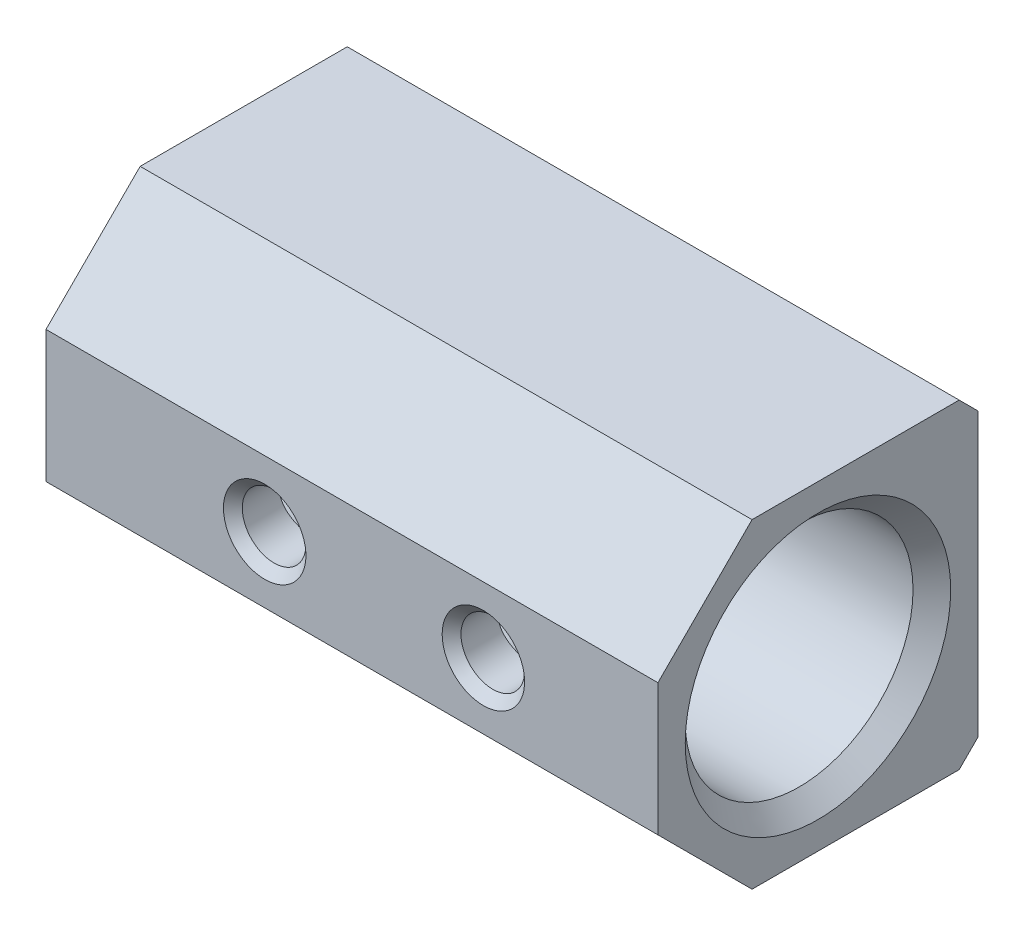
ISO-10303-21;
HEADER;
FILE_DESCRIPTION(('STEP AP214'),'2;1');
FILE_NAME('part.step','',(''),(''),'','','');
FILE_SCHEMA(('AUTOMOTIVE_DESIGN { 1 0 10303 214 1 1 1 1 }'));
ENDSEC;
DATA;
#1=APPLICATION_CONTEXT('core data for automotive mechanical design processes');
#2=APPLICATION_PROTOCOL_DEFINITION('international standard','automotive_design',2000,#1);
#3=PRODUCT_CONTEXT('',#1,'mechanical');
#4=PRODUCT('Part','Part','',(#3));
#5=PRODUCT_RELATED_PRODUCT_CATEGORY('part','',(#4));
#6=PRODUCT_DEFINITION_FORMATION('','',#4);
#7=PRODUCT_DEFINITION_CONTEXT('part definition',#1,'design');
#8=PRODUCT_DEFINITION('design','',#6,#7);
#9=PRODUCT_DEFINITION_SHAPE('','',#8);
#10=(LENGTH_UNIT() NAMED_UNIT(*) SI_UNIT(.MILLI.,.METRE.));
#11=(NAMED_UNIT(*) PLANE_ANGLE_UNIT() SI_UNIT($,.RADIAN.));
#12=(NAMED_UNIT(*) SI_UNIT($,.STERADIAN.) SOLID_ANGLE_UNIT());
#13=UNCERTAINTY_MEASURE_WITH_UNIT(LENGTH_MEASURE(1.E-05),#10,'distance_accuracy_value','');
#14=(GEOMETRIC_REPRESENTATION_CONTEXT(3) GLOBAL_UNCERTAINTY_ASSIGNED_CONTEXT((#13)) GLOBAL_UNIT_ASSIGNED_CONTEXT((#10,
#11,#12)) REPRESENTATION_CONTEXT('',''));
#15=CARTESIAN_POINT('',(0.,0.,0.));
#16=DIRECTION('',(0.,0.,1.));
#17=DIRECTION('',(1.,0.,0.));
#18=AXIS2_PLACEMENT_3D('',#15,#16,#17);
#19=CARTESIAN_POINT('',(32.5,-17.,34.));
#20=DIRECTION('',(-1.,0.,0.));
#21=DIRECTION('',(0.,0.,1.));
#22=AXIS2_PLACEMENT_3D('',#19,#20,#21);
#23=PLANE('',#22);
#24=CARTESIAN_POINT('',(32.5,0.,17.));
#25=DIRECTION('',(-1.,0.,0.));
#26=DIRECTION('',(0.,0.,1.));
#27=AXIS2_PLACEMENT_3D('',#24,#25,#26);
#28=CIRCLE('',#27,14.1);
#29=CARTESIAN_POINT('',(32.5,0.,31.1));
#30=VERTEX_POINT('',#29);
#31=EDGE_CURVE('E183',#30,#30,#28,.T.);
#32=ORIENTED_EDGE('',*,*,#31,.T.);
#33=EDGE_LOOP('',(#32));
#34=FACE_BOUND('',#33,.T.);
#35=DIRECTION('',(0.,1.,0.));
#36=VECTOR('',#35,1.);
#37=CARTESIAN_POINT('',(32.5,-17.,0.));
#38=LINE('',#37,#36);
#39=CARTESIAN_POINT('',(32.5,-15.,0.));
#40=VERTEX_POINT('',#39);
#41=CARTESIAN_POINT('',(32.5,15.,0.));
#42=VERTEX_POINT('',#41);
#43=EDGE_CURVE('E142',#40,#42,#38,.T.);
#44=ORIENTED_EDGE('',*,*,#43,.T.);
#45=DIRECTION('',(0.,0.707106781186549,0.707106781186546));
#46=VECTOR('',#45,1.);
#47=CARTESIAN_POINT('',(32.5,17.,2.00000000000001));
#48=LINE('',#47,#46);
#49=CARTESIAN_POINT('',(32.5,17.,2.00000000000001));
#50=VERTEX_POINT('',#49);
#51=EDGE_CURVE('E176',#42,#50,#48,.T.);
#52=ORIENTED_EDGE('',*,*,#51,.T.);
#53=DIRECTION('',(0.,0.,-1.));
#54=VECTOR('',#53,1.);
#55=CARTESIAN_POINT('',(32.5,17.,34.));
#56=LINE('',#55,#54);
#57=CARTESIAN_POINT('',(32.5,17.,24.));
#58=VERTEX_POINT('',#57);
#59=EDGE_CURVE('E133',#58,#50,#56,.T.);
#60=ORIENTED_EDGE('',*,*,#59,.F.);
#61=DIRECTION('',(0.,0.707106781186546,-0.707106781186549));
#62=VECTOR('',#61,1.);
#63=CARTESIAN_POINT('',(32.5,7.00000000000001,34.));
#64=LINE('',#63,#62);
#65=CARTESIAN_POINT('',(32.5,7.00000000000001,34.));
#66=VERTEX_POINT('',#65);
#67=EDGE_CURVE('E120',#58,#66,#64,.F.);
#68=ORIENTED_EDGE('',*,*,#67,.T.);
#69=DIRECTION('',(0.,1.,0.));
#70=VECTOR('',#69,1.);
#71=CARTESIAN_POINT('',(32.5,-17.,34.));
#72=LINE('',#71,#70);
#73=CARTESIAN_POINT('',(32.5,-7.00000000000001,34.));
#74=VERTEX_POINT('',#73);
#75=EDGE_CURVE('E128',#74,#66,#72,.T.);
#76=ORIENTED_EDGE('',*,*,#75,.F.);
#77=DIRECTION('',(0.,0.707106781186546,0.707106781186549));
#78=VECTOR('',#77,1.);
#79=CARTESIAN_POINT('',(32.5,-7.00000000000001,34.));
#80=LINE('',#79,#78);
#81=CARTESIAN_POINT('',(32.5,-17.,24.));
#82=VERTEX_POINT('',#81);
#83=EDGE_CURVE('E110',#74,#82,#80,.F.);
#84=ORIENTED_EDGE('',*,*,#83,.T.);
#85=DIRECTION('',(0.,0.,-1.));
#86=VECTOR('',#85,1.);
#87=CARTESIAN_POINT('',(32.5,-17.,34.));
#88=LINE('',#87,#86);
#89=CARTESIAN_POINT('',(32.5,-17.,2.00000000000001));
#90=VERTEX_POINT('',#89);
#91=EDGE_CURVE('E139',#82,#90,#88,.T.);
#92=ORIENTED_EDGE('',*,*,#91,.T.);
#93=DIRECTION('',(0.,0.707106781186549,-0.707106781186546));
#94=VECTOR('',#93,1.);
#95=CARTESIAN_POINT('',(32.5,-17.,2.00000000000001));
#96=LINE('',#95,#94);
#97=EDGE_CURVE('E57',#90,#40,#96,.T.);
#98=ORIENTED_EDGE('',*,*,#97,.T.);
#99=EDGE_LOOP('',(#44,#52,#60,#68,#76,#84,#92,#98));
#100=FACE_BOUND('',#99,.T.);
#101=ADVANCED_FACE('F41',(#34,#100),#23,.F.);
#102=CARTESIAN_POINT('',(-32.5,17.,34.));
#103=DIRECTION('',(0.,-1.,0.));
#104=DIRECTION('',(0.,0.,-1.));
#105=AXIS2_PLACEMENT_3D('',#102,#103,#104);
#106=PLANE('',#105);
#107=ORIENTED_EDGE('',*,*,#59,.T.);
#108=DIRECTION('',(-1.,0.,0.));
#109=VECTOR('',#108,1.);
#110=CARTESIAN_POINT('',(-32.5,17.,2.00000000000001));
#111=LINE('',#110,#109);
#112=CARTESIAN_POINT('',(-32.5,17.,2.00000000000001));
#113=VERTEX_POINT('',#112);
#114=EDGE_CURVE('E165',#50,#113,#111,.T.);
#115=ORIENTED_EDGE('',*,*,#114,.T.);
#116=DIRECTION('',(0.,0.,-1.));
#117=VECTOR('',#116,1.);
#118=CARTESIAN_POINT('',(-32.5,17.,34.));
#119=LINE('',#118,#117);
#120=CARTESIAN_POINT('',(-32.5,17.,24.));
#121=VERTEX_POINT('',#120);
#122=EDGE_CURVE('E152',#121,#113,#119,.T.);
#123=ORIENTED_EDGE('',*,*,#122,.F.);
#124=DIRECTION('',(1.,0.,0.));
#125=VECTOR('',#124,1.);
#126=CARTESIAN_POINT('',(-32.5,17.,24.));
#127=LINE('',#126,#125);
#128=EDGE_CURVE('E121',#121,#58,#127,.T.);
#129=ORIENTED_EDGE('',*,*,#128,.T.);
#130=EDGE_LOOP('',(#107,#115,#123,#129));
#131=FACE_BOUND('',#130,.T.);
#132=ADVANCED_FACE('F267',(#131),#106,.F.);
#133=CARTESIAN_POINT('',(-32.5,-17.,34.));
#134=DIRECTION('',(1.,0.,0.));
#135=DIRECTION('',(0.,0.,-1.));
#136=AXIS2_PLACEMENT_3D('',#133,#134,#135);
#137=PLANE('',#136);
#138=CARTESIAN_POINT('',(-32.5,0.,17.));
#139=DIRECTION('',(1.,0.,0.));
#140=DIRECTION('',(0.,0.,-1.));
#141=AXIS2_PLACEMENT_3D('',#138,#139,#140);
#142=CIRCLE('',#141,12.1);
#143=CARTESIAN_POINT('',(-32.5,0.,4.9));
#144=VERTEX_POINT('',#143);
#145=EDGE_CURVE('E145',#144,#144,#142,.T.);
#146=ORIENTED_EDGE('',*,*,#145,.T.);
#147=EDGE_LOOP('',(#146));
#148=FACE_BOUND('',#147,.T.);
#149=ORIENTED_EDGE('',*,*,#122,.T.);
#150=DIRECTION('',(0.,-0.707106781186549,-0.707106781186546));
#151=VECTOR('',#150,1.);
#152=CARTESIAN_POINT('',(-32.5,17.,2.00000000000001));
#153=LINE('',#152,#151);
#154=CARTESIAN_POINT('',(-32.5,15.,0.));
#155=VERTEX_POINT('',#154);
#156=EDGE_CURVE('E170',#113,#155,#153,.T.);
#157=ORIENTED_EDGE('',*,*,#156,.T.);
#158=DIRECTION('',(0.,-1.,0.));
#159=VECTOR('',#158,1.);
#160=CARTESIAN_POINT('',(-32.5,-17.,0.));
#161=LINE('',#160,#159);
#162=CARTESIAN_POINT('',(-32.5,-15.,0.));
#163=VERTEX_POINT('',#162);
#164=EDGE_CURVE('E137',#155,#163,#161,.T.);
#165=ORIENTED_EDGE('',*,*,#164,.T.);
#166=DIRECTION('',(0.,-0.707106781186549,0.707106781186546));
#167=VECTOR('',#166,1.);
#168=CARTESIAN_POINT('',(-32.5,-17.,2.00000000000001));
#169=LINE('',#168,#167);
#170=CARTESIAN_POINT('',(-32.5,-17.,2.00000000000001));
#171=VERTEX_POINT('',#170);
#172=EDGE_CURVE('E168',#163,#171,#169,.T.);
#173=ORIENTED_EDGE('',*,*,#172,.T.);
#174=DIRECTION('',(0.,0.,-1.));
#175=VECTOR('',#174,1.);
#176=CARTESIAN_POINT('',(-32.5,-17.,34.));
#177=LINE('',#176,#175);
#178=CARTESIAN_POINT('',(-32.5,-17.,24.));
#179=VERTEX_POINT('',#178);
#180=EDGE_CURVE('E149',#179,#171,#177,.T.);
#181=ORIENTED_EDGE('',*,*,#180,.F.);
#182=DIRECTION('',(0.,-0.707106781186546,-0.707106781186549));
#183=VECTOR('',#182,1.);
#184=CARTESIAN_POINT('',(-32.5,-7.00000000000001,34.));
#185=LINE('',#184,#183);
#186=CARTESIAN_POINT('',(-32.5,-7.00000000000001,34.));
#187=VERTEX_POINT('',#186);
#188=EDGE_CURVE('E158',#179,#187,#185,.F.);
#189=ORIENTED_EDGE('',*,*,#188,.T.);
#190=DIRECTION('',(0.,-1.,0.));
#191=VECTOR('',#190,1.);
#192=CARTESIAN_POINT('',(-32.5,-17.,34.));
#193=LINE('',#192,#191);
#194=CARTESIAN_POINT('',(-32.5,7.00000000000001,34.));
#195=VERTEX_POINT('',#194);
#196=EDGE_CURVE('E131',#195,#187,#193,.T.);
#197=ORIENTED_EDGE('',*,*,#196,.F.);
#198=DIRECTION('',(0.,-0.707106781186546,0.707106781186549));
#199=VECTOR('',#198,1.);
#200=CARTESIAN_POINT('',(-32.5,7.00000000000001,34.));
#201=LINE('',#200,#199);
#202=EDGE_CURVE('E160',#195,#121,#201,.F.);
#203=ORIENTED_EDGE('',*,*,#202,.T.);
#204=EDGE_LOOP('',(#149,#157,#165,#173,#181,#189,#197,#203));
#205=FACE_BOUND('',#204,.T.);
#206=ADVANCED_FACE('F271',(#148,#205),#137,.F.);
#207=CARTESIAN_POINT('',(-32.5,-17.,34.));
#208=DIRECTION('',(0.,1.,0.));
#209=DIRECTION('',(0.,0.,1.));
#210=AXIS2_PLACEMENT_3D('',#207,#208,#209);
#211=PLANE('',#210);
#212=ORIENTED_EDGE('',*,*,#180,.T.);
#213=DIRECTION('',(1.,0.,0.));
#214=VECTOR('',#213,1.);
#215=CARTESIAN_POINT('',(32.5,-17.,2.00000000000001));
#216=LINE('',#215,#214);
#217=EDGE_CURVE('E178',#171,#90,#216,.T.);
#218=ORIENTED_EDGE('',*,*,#217,.T.);
#219=ORIENTED_EDGE('',*,*,#91,.F.);
#220=DIRECTION('',(-1.,0.,0.));
#221=VECTOR('',#220,1.);
#222=CARTESIAN_POINT('',(-32.5,-17.,24.));
#223=LINE('',#222,#221);
#224=EDGE_CURVE('E115',#82,#179,#223,.T.);
#225=ORIENTED_EDGE('',*,*,#224,.T.);
#226=EDGE_LOOP('',(#212,#218,#219,#225));
#227=FACE_BOUND('',#226,.T.);
#228=ADVANCED_FACE('F274',(#227),#211,.F.);
#229=CARTESIAN_POINT('',(0.,0.,34.));
#230=DIRECTION('',(0.,0.,-1.));
#231=DIRECTION('',(-1.,0.,0.));
#232=AXIS2_PLACEMENT_3D('',#229,#230,#231);
#233=PLANE('',#232);
#234=CARTESIAN_POINT('',(13.96,0.,34.));
#235=DIRECTION('',(0.,0.,-1.));
#236=DIRECTION('',(-1.,0.,0.));
#237=AXIS2_PLACEMENT_3D('',#234,#235,#236);
#238=CIRCLE('',#237,4.38);
#239=CARTESIAN_POINT('',(9.57999999999998,0.,34.));
#240=VERTEX_POINT('',#239);
#241=EDGE_CURVE('E233',#240,#240,#238,.T.);
#242=ORIENTED_EDGE('',*,*,#241,.T.);
#243=EDGE_LOOP('',(#242));
#244=FACE_BOUND('',#243,.T.);
#245=CARTESIAN_POINT('',(-9.27000000000001,0.,34.));
#246=DIRECTION('',(0.,0.,-1.));
#247=DIRECTION('',(-1.,0.,0.));
#248=AXIS2_PLACEMENT_3D('',#245,#246,#247);
#249=CIRCLE('',#248,4.38000000000003);
#250=CARTESIAN_POINT('',(-13.65,0.,34.));
#251=VERTEX_POINT('',#250);
#252=EDGE_CURVE('E230',#251,#251,#249,.T.);
#253=ORIENTED_EDGE('',*,*,#252,.T.);
#254=EDGE_LOOP('',(#253));
#255=FACE_BOUND('',#254,.T.);
#256=ORIENTED_EDGE('',*,*,#75,.T.);
#257=DIRECTION('',(-1.,0.,0.));
#258=VECTOR('',#257,1.);
#259=CARTESIAN_POINT('',(0.,7.00000000000001,34.));
#260=LINE('',#259,#258);
#261=EDGE_CURVE('E132',#66,#195,#260,.T.);
#262=ORIENTED_EDGE('',*,*,#261,.T.);
#263=ORIENTED_EDGE('',*,*,#196,.T.);
#264=DIRECTION('',(1.,0.,0.));
#265=VECTOR('',#264,1.);
#266=CARTESIAN_POINT('',(0.,-7.00000000000001,34.));
#267=LINE('',#266,#265);
#268=EDGE_CURVE('E114',#187,#74,#267,.T.);
#269=ORIENTED_EDGE('',*,*,#268,.T.);
#270=EDGE_LOOP('',(#256,#262,#263,#269));
#271=FACE_BOUND('',#270,.T.);
#272=ADVANCED_FACE('F126',(#244,#255,#271),#233,.F.);
#273=CARTESIAN_POINT('',(0.,0.,0.));
#274=DIRECTION('',(0.,0.,-1.));
#275=DIRECTION('',(-1.,0.,0.));
#276=AXIS2_PLACEMENT_3D('',#273,#274,#275);
#277=PLANE('',#276);
#278=CARTESIAN_POINT('',(-9.27000000000001,0.,0.));
#279=DIRECTION('',(0.,0.,-1.));
#280=DIRECTION('',(-1.,0.,0.));
#281=AXIS2_PLACEMENT_3D('',#278,#279,#280);
#282=CIRCLE('',#281,4.38);
#283=CARTESIAN_POINT('',(-13.65,0.,0.));
#284=VERTEX_POINT('',#283);
#285=EDGE_CURVE('E242',#284,#284,#282,.F.);
#286=ORIENTED_EDGE('',*,*,#285,.T.);
#287=EDGE_LOOP('',(#286));
#288=FACE_BOUND('',#287,.T.);
#289=CARTESIAN_POINT('',(13.96,0.,0.));
#290=DIRECTION('',(0.,0.,-1.));
#291=DIRECTION('',(-1.,0.,0.));
#292=AXIS2_PLACEMENT_3D('',#289,#290,#291);
#293=CIRCLE('',#292,4.38);
#294=CARTESIAN_POINT('',(9.57999999999999,0.,0.));
#295=VERTEX_POINT('',#294);
#296=EDGE_CURVE('E239',#295,#295,#293,.F.);
#297=ORIENTED_EDGE('',*,*,#296,.T.);
#298=EDGE_LOOP('',(#297));
#299=FACE_BOUND('',#298,.T.);
#300=ORIENTED_EDGE('',*,*,#164,.F.);
#301=DIRECTION('',(1.,0.,0.));
#302=VECTOR('',#301,1.);
#303=CARTESIAN_POINT('',(32.5,15.,0.));
#304=LINE('',#303,#302);
#305=EDGE_CURVE('E65',#155,#42,#304,.T.);
#306=ORIENTED_EDGE('',*,*,#305,.T.);
#307=ORIENTED_EDGE('',*,*,#43,.F.);
#308=DIRECTION('',(-1.,0.,0.));
#309=VECTOR('',#308,1.);
#310=CARTESIAN_POINT('',(-32.5,-15.,0.));
#311=LINE('',#310,#309);
#312=EDGE_CURVE('E172',#40,#163,#311,.T.);
#313=ORIENTED_EDGE('',*,*,#312,.T.);
#314=EDGE_LOOP('',(#300,#306,#307,#313));
#315=FACE_BOUND('',#314,.T.);
#316=ADVANCED_FACE('F254',(#288,#299,#315),#277,.T.);
#317=CARTESIAN_POINT('',(0.,7.00000000000001,34.));
#318=DIRECTION('',(0.,-0.707106781186549,-0.707106781186546));
#319=DIRECTION('',(-1.,0.,0.));
#320=AXIS2_PLACEMENT_3D('',#317,#318,#319);
#321=PLANE('',#320);
#322=ORIENTED_EDGE('',*,*,#67,.F.);
#323=ORIENTED_EDGE('',*,*,#128,.F.);
#324=ORIENTED_EDGE('',*,*,#202,.F.);
#325=ORIENTED_EDGE('',*,*,#261,.F.);
#326=EDGE_LOOP('',(#322,#323,#324,#325));
#327=FACE_BOUND('',#326,.T.);
#328=ADVANCED_FACE('F257',(#327),#321,.F.);
#329=CARTESIAN_POINT('',(0.,-7.00000000000001,34.));
#330=DIRECTION('',(0.,0.707106781186549,-0.707106781186546));
#331=DIRECTION('',(1.,0.,0.));
#332=AXIS2_PLACEMENT_3D('',#329,#330,#331);
#333=PLANE('',#332);
#334=ORIENTED_EDGE('',*,*,#188,.F.);
#335=ORIENTED_EDGE('',*,*,#224,.F.);
#336=ORIENTED_EDGE('',*,*,#83,.F.);
#337=ORIENTED_EDGE('',*,*,#268,.F.);
#338=EDGE_LOOP('',(#334,#335,#336,#337));
#339=FACE_BOUND('',#338,.T.);
#340=ADVANCED_FACE('F113',(#339),#333,.F.);
#341=CARTESIAN_POINT('',(-32.5,17.,2.00000000000001));
#342=DIRECTION('',(0.,0.707106781186546,-0.707106781186549));
#343=DIRECTION('',(1.,0.,0.));
#344=AXIS2_PLACEMENT_3D('',#341,#342,#343);
#345=PLANE('',#344);
#346=ORIENTED_EDGE('',*,*,#51,.F.);
#347=ORIENTED_EDGE('',*,*,#305,.F.);
#348=ORIENTED_EDGE('',*,*,#156,.F.);
#349=ORIENTED_EDGE('',*,*,#114,.F.);
#350=EDGE_LOOP('',(#346,#347,#348,#349));
#351=FACE_BOUND('',#350,.T.);
#352=ADVANCED_FACE('F264',(#351),#345,.T.);
#353=CARTESIAN_POINT('',(-32.5,-17.,2.00000000000001));
#354=DIRECTION('',(0.,-0.707106781186546,-0.707106781186549));
#355=DIRECTION('',(-1.,0.,0.));
#356=AXIS2_PLACEMENT_3D('',#353,#354,#355);
#357=PLANE('',#356);
#358=ORIENTED_EDGE('',*,*,#172,.F.);
#359=ORIENTED_EDGE('',*,*,#312,.F.);
#360=ORIENTED_EDGE('',*,*,#97,.F.);
#361=ORIENTED_EDGE('',*,*,#217,.F.);
#362=EDGE_LOOP('',(#358,#359,#360,#361));
#363=FACE_BOUND('',#362,.T.);
#364=ADVANCED_FACE('F275',(#363),#357,.T.);
#365=CARTESIAN_POINT('',(-32.5,0.,17.));
#366=DIRECTION('',(1.,0.,0.));
#367=DIRECTION('',(0.,0.,-1.));
#368=AXIS2_PLACEMENT_3D('',#365,#366,#367);
#369=CYLINDRICAL_SURFACE('',#368,12.1);
#370=CARTESIAN_POINT('',(-12.65,0.,4.9));
#371=CARTESIAN_POINT('',(-12.6499963116933,0.185996758834312,4.90000243582222));
#372=CARTESIAN_POINT('',(-12.634595992045,0.372031922336143,4.90433038117077));
#373=CARTESIAN_POINT('',(-12.5735242028092,0.738721465797772,4.92117423720277));
#374=CARTESIAN_POINT('',(-12.5278402193571,0.919373589108784,4.93369353270141));
#375=CARTESIAN_POINT('',(-12.407818508993,1.26995267342928,4.9655419459768));
#376=CARTESIAN_POINT('',(-12.333519713404,1.43989384304288,4.98486180831615));
#377=CARTESIAN_POINT('',(-12.1585274886104,1.76490476339321,5.02828208461763));
#378=CARTESIAN_POINT('',(-12.0578316337241,1.91997314564838,5.05238293786562));
#379=CARTESIAN_POINT('',(-11.8302225743183,2.21474977140473,5.10345469822731));
#380=CARTESIAN_POINT('',(-11.702766037177,2.35402934520326,5.1304783437194));
#381=CARTESIAN_POINT('',(-11.4264137679315,2.60954081329851,5.18402036758998));
#382=CARTESIAN_POINT('',(-11.2775149869983,2.72576942442953,5.21053867350709));
#383=CARTESIAN_POINT('',(-10.9590081347417,2.93402998001807,5.26061358149378));
#384=CARTESIAN_POINT('',(-10.7890590556021,3.02555778584751,5.28410399903987));
#385=CARTESIAN_POINT('',(-10.4354210380662,3.1785671834504,5.32468326182425));
#386=CARTESIAN_POINT('',(-10.25173491848,3.24005491997874,5.34177341608181));
#387=CARTESIAN_POINT('',(-9.880609873576,3.32972900173922,5.36707076251832));
#388=CARTESIAN_POINT('',(-9.6933744892252,3.35869749910415,5.37548617255287));
#389=CARTESIAN_POINT('',(-9.316526837184,3.38495082726723,5.38310235474345));
#390=CARTESIAN_POINT('',(-9.12691506900274,3.38224220852256,5.38230503198529));
#391=CARTESIAN_POINT('',(-8.75689349420962,3.34583669549744,5.37177153270749));
#392=CARTESIAN_POINT('',(-8.57638025181689,3.31309820445398,5.36231183165641));
#393=CARTESIAN_POINT('',(-8.22351695983025,3.2191022125181,5.33596381620812));
#394=CARTESIAN_POINT('',(-8.0511676204433,3.15784223544177,5.31907485682313));
#395=CARTESIAN_POINT('',(-7.71708321826922,3.00778925548053,5.27953654326359));
#396=CARTESIAN_POINT('',(-7.55550322744828,2.918669598846,5.25681945298033));
#397=CARTESIAN_POINT('',(-7.2492603231076,2.7156545552282,5.20821950343652));
#398=CARTESIAN_POINT('',(-7.10460103861751,2.60175386831693,5.18233596748622));
#399=CARTESIAN_POINT('',(-6.83084421722025,2.34756108957777,5.1291794916884));
#400=CARTESIAN_POINT('',(-6.70249293529766,2.20646753594556,5.10189005203214));
#401=CARTESIAN_POINT('',(-6.47111271486006,1.90442186685111,5.04982723581469));
#402=CARTESIAN_POINT('',(-6.36808497605743,1.74346881107984,5.02505397849121));
#403=CARTESIAN_POINT('',(-6.18990301349252,1.40504403620514,4.98063696255349));
#404=CARTESIAN_POINT('',(-6.11489498654054,1.22749155818453,4.96102026220995));
#405=CARTESIAN_POINT('',(-5.99601420462164,0.861621024199097,4.92932174248736));
#406=CARTESIAN_POINT('',(-5.95213396038823,0.673305569569642,4.91723811075574));
#407=CARTESIAN_POINT('',(-5.89795189422023,0.297614207162428,4.90224596130082));
#408=CARTESIAN_POINT('',(-5.88663671038702,0.110395269728796,4.89906064089046));
#409=CARTESIAN_POINT('',(-5.89509209279133,-0.263269178779309,4.9014222240412));
#410=CARTESIAN_POINT('',(-5.91485910737032,-0.449714775780057,4.90696812991446));
#411=CARTESIAN_POINT('',(-5.98409049207251,-0.812846825504042,4.92598924599228));
#412=CARTESIAN_POINT('',(-6.0329797494616,-0.989651719629074,4.93931080094588));
#413=CARTESIAN_POINT('',(-6.15839116977399,-1.33252587852919,4.9723623328416));
#414=CARTESIAN_POINT('',(-6.23491646505978,-1.49859392383666,4.99209303619289));
#415=CARTESIAN_POINT('',(-6.41524094258971,-1.81914158789609,5.03641048589113));
#416=CARTESIAN_POINT('',(-6.51957832813203,-1.97330523118977,5.06109037386924));
#417=CARTESIAN_POINT('',(-6.75189723400195,-2.2622880275918,5.11245899314524));
#418=CARTESIAN_POINT('',(-6.87988389241227,-2.39710296563579,5.13914816023453));
#419=CARTESIAN_POINT('',(-7.16061211948968,-2.64790413622928,5.19256249241452));
#420=CARTESIAN_POINT('',(-7.31400079938077,-2.76317274188574,5.21926286389239));
#421=CARTESIAN_POINT('',(-7.63851689029255,-2.96636220203822,5.26877359971292));
#422=CARTESIAN_POINT('',(-7.80964363340442,-3.05428408574904,5.29158411043886));
#423=CARTESIAN_POINT('',(-8.16401123263858,-3.19963260086073,5.33046632513879));
#424=CARTESIAN_POINT('',(-8.34717893262411,-3.25722714447208,5.3465750282507));
#425=CARTESIAN_POINT('',(-8.72113330136028,-3.34063123020659,5.3702064475279));
#426=CARTESIAN_POINT('',(-8.91191777142471,-3.36644987736303,5.37773162316322));
#427=CARTESIAN_POINT('',(-9.28830481334448,-3.38500910522687,5.38312462185352));
#428=CARTESIAN_POINT('',(-9.47384619603268,-3.37890878782472,5.38133086866866));
#429=CARTESIAN_POINT('',(-9.84114222946674,-3.33652068023149,5.36908833811714));
#430=CARTESIAN_POINT('',(-10.0228969961414,-3.30023381561035,5.35863982611988));
#431=CARTESIAN_POINT('',(-10.3758421195019,-3.19920397576475,5.33047625087756));
#432=CARTESIAN_POINT('',(-10.5471150911,-3.13472912914028,5.31282975946112));
#433=CARTESIAN_POINT('',(-10.8765463603579,-2.97936087985841,5.27226252386616));
#434=CARTESIAN_POINT('',(-11.0347024180954,-2.88846297693291,5.24934088138388));
#435=CARTESIAN_POINT('',(-11.3388872256157,-2.67941132677913,5.19988874567218));
#436=CARTESIAN_POINT('',(-11.484364924313,-2.56047748444792,5.1732661423472));
#437=CARTESIAN_POINT('',(-11.7536736997767,-2.30018431111536,5.11990009829178));
#438=CARTESIAN_POINT('',(-11.8774993854211,-2.15881941168352,5.09315662916263));
#439=CARTESIAN_POINT('',(-12.1029467526592,-1.85355719801269,5.04178845771431));
#440=CARTESIAN_POINT('',(-12.2039595814501,-1.689197945754,5.01723057040034));
#441=CARTESIAN_POINT('',(-12.3767653845958,-1.34514579400514,4.973755326743));
#442=CARTESIAN_POINT('',(-12.4485752916835,-1.16546185356185,4.95483470345083));
#443=CARTESIAN_POINT('',(-12.5526295870309,-0.822295832541747,4.92692524458849));
#444=CARTESIAN_POINT('',(-12.5890536934412,-0.660153367064857,4.91690537856469));
#445=CARTESIAN_POINT('',(-12.6377390845851,-0.332017155332709,4.90344206690946));
#446=CARTESIAN_POINT('',(-12.6500032922455,-0.166023877417473,4.89999782574357));
#447=CARTESIAN_POINT('',(-12.65,0.,4.9));
#448=B_SPLINE_CURVE_WITH_KNOTS('',3,(#370,#371,#372,#373,#374,#375,#376,#377,#378,#379,#380,
#381,#382,#383,#384,#385,#386,#387,#388,#389,#390,#391,#392,#393,#394,#395,#396,#397,#398,#399,
#400,#401,#402,#403,#404,#405,#406,#407,#408,#409,#410,#411,#412,#413,#414,#415,#416,#417,#418,
#419,#420,#421,#422,#423,#424,#425,#426,#427,#428,#429,#430,#431,#432,#433,#434,#435,#436,#437,
#438,#439,#440,#441,#442,#443,#444,#445,#446,#447),.UNSPECIFIED.,.T.,.F.,(4,2,2,2,2,2,2,2,2,2,2,
2,2,2,2,2,2,2,2,2,2,2,2,2,2,2,2,2,2,2,2,2,2,2,2,2,2,2,4),(0.,0.557381064897284,1.11499259539235,
1.67184814326902,2.22875487973082,2.79830562084026,3.36793742531694,3.9484408608319,
4.52882550346613,5.09492985009666,5.66091713503876,6.20944667188254,6.75802383995297,
7.31329088473449,7.86867680162419,8.44402567911558,9.01940180872533,9.59773944814994,
10.1759378937513,10.7359384411679,11.2958750038508,11.8451042375623,12.3943957423302,
12.9552040910842,13.5161344256167,14.0945438944097,14.6729315916852,15.2480823556235,
15.8230682780442,16.3773224293023,16.9315595868291,17.4806357118657,18.0298054081742,
18.5965738366696,19.1634831841788,19.7440916020284,20.3243628839841,20.8219509267532,
21.3194787663419),.UNSPECIFIED.);
#449=CARTESIAN_POINT('',(-12.65,0.,4.9));
#450=VERTEX_POINT('',#449);
#451=EDGE_CURVE('E222',#450,#450,#448,.T.);
#452=ORIENTED_EDGE('',*,*,#451,.T.);
#453=EDGE_LOOP('',(#452));
#454=FACE_BOUND('',#453,.T.);
#455=CARTESIAN_POINT('',(-5.89000000000001,0.,29.1));
#456=CARTESIAN_POINT('',(-5.89000368830678,0.185996758834312,29.0999975641778));
#457=CARTESIAN_POINT('',(-5.90540400795506,0.372031922336143,29.0956696188292));
#458=CARTESIAN_POINT('',(-5.96647579719087,0.738721465797772,29.0788257627972));
#459=CARTESIAN_POINT('',(-6.01215978064289,0.919373589108784,29.0663064672986));
#460=CARTESIAN_POINT('',(-6.13218149100701,1.26995267342928,29.0344580540232));
#461=CARTESIAN_POINT('',(-6.20648028659603,1.43989384304288,29.0151381916839));
#462=CARTESIAN_POINT('',(-6.38147251138962,1.76490476339321,28.9717179153824));
#463=CARTESIAN_POINT('',(-6.48216836627594,1.91997314564838,28.9476170621344));
#464=CARTESIAN_POINT('',(-6.7097774256817,2.21474977140473,28.8965453017727));
#465=CARTESIAN_POINT('',(-6.83723396282298,2.35402934520326,28.8695216562806));
#466=CARTESIAN_POINT('',(-7.11358623206852,2.60954081329851,28.81597963241));
#467=CARTESIAN_POINT('',(-7.26248501300173,2.72576942442953,28.7894613264929));
#468=CARTESIAN_POINT('',(-7.58099186525832,2.93402998001808,28.7393864185062));
#469=CARTESIAN_POINT('',(-7.75094094439798,3.02555778584751,28.7158960009601));
#470=CARTESIAN_POINT('',(-8.10457896193379,3.1785671834504,28.6753167381757));
#471=CARTESIAN_POINT('',(-8.28826508152003,3.24005491997874,28.6582265839182));
#472=CARTESIAN_POINT('',(-8.65939012642403,3.32972900173922,28.6329292374817));
#473=CARTESIAN_POINT('',(-8.84662551077483,3.35869749910415,28.6245138274471));
#474=CARTESIAN_POINT('',(-9.22347316281603,3.38495082726723,28.6168976452566));
#475=CARTESIAN_POINT('',(-9.41308493099728,3.38224220852256,28.6176949680147));
#476=CARTESIAN_POINT('',(-9.78310650579041,3.34583669549744,28.6282284672925));
#477=CARTESIAN_POINT('',(-9.96361974818314,3.31309820445398,28.6376881683436));
#478=CARTESIAN_POINT('',(-10.3164830401698,3.2191022125181,28.6640361837919));
#479=CARTESIAN_POINT('',(-10.4888323795567,3.15784223544177,28.6809251431769));
#480=CARTESIAN_POINT('',(-10.8229167817308,3.00778925548053,28.7204634567364));
#481=CARTESIAN_POINT('',(-10.9844967725517,2.918669598846,28.7431805470197));
#482=CARTESIAN_POINT('',(-11.2907396768924,2.7156545552282,28.7917804965635));
#483=CARTESIAN_POINT('',(-11.4353989613825,2.60175386831693,28.8176640325138));
#484=CARTESIAN_POINT('',(-11.7091557827798,2.34756108957777,28.8708205083116));
#485=CARTESIAN_POINT('',(-11.8375070647024,2.20646753594556,28.8981099479679));
#486=CARTESIAN_POINT('',(-12.06888728514,1.90442186685111,28.9501727641853));
#487=CARTESIAN_POINT('',(-12.1719150239426,1.74346881107984,28.9749460215088));
#488=CARTESIAN_POINT('',(-12.3500969865075,1.40504403620514,29.0193630374465));
#489=CARTESIAN_POINT('',(-12.4251050134595,1.22749155818453,29.0389797377901));
#490=CARTESIAN_POINT('',(-12.5439857953784,0.861621024199097,29.0706782575126));
#491=CARTESIAN_POINT('',(-12.5878660396118,0.673305569569642,29.0827618892443));
#492=CARTESIAN_POINT('',(-12.6420481057798,0.297614207162427,29.0977540386992));
#493=CARTESIAN_POINT('',(-12.653363289613,0.110395269728796,29.1009393591095));
#494=CARTESIAN_POINT('',(-12.6449079072087,-0.263269178779308,29.0985777759588));
#495=CARTESIAN_POINT('',(-12.6251408926297,-0.449714775780057,29.0930318700855));
#496=CARTESIAN_POINT('',(-12.5559095079275,-0.812846825504042,29.0740107540077));
#497=CARTESIAN_POINT('',(-12.5070202505384,-0.989651719629073,29.0606891990541));
#498=CARTESIAN_POINT('',(-12.381608830226,-1.33252587852919,29.0276376671584));
#499=CARTESIAN_POINT('',(-12.3050835349403,-1.49859392383666,29.0079069638071));
#500=CARTESIAN_POINT('',(-12.1247590574103,-1.81914158789609,28.9635895141089));
#501=CARTESIAN_POINT('',(-12.020421671868,-1.97330523118977,28.9389096261308));
#502=CARTESIAN_POINT('',(-11.7881027659981,-2.2622880275918,28.8875410068548));
#503=CARTESIAN_POINT('',(-11.6601161075878,-2.39710296563579,28.8608518397655));
#504=CARTESIAN_POINT('',(-11.3793878805103,-2.64790413622928,28.8074375075855));
#505=CARTESIAN_POINT('',(-11.2259992006193,-2.76317274188574,28.7807371361076));
#506=CARTESIAN_POINT('',(-10.9014831097075,-2.96636220203822,28.7312264002871));
#507=CARTESIAN_POINT('',(-10.7303563665956,-3.05428408574904,28.7084158895611));
#508=CARTESIAN_POINT('',(-10.3759887673615,-3.19963260086073,28.6695336748612));
#509=CARTESIAN_POINT('',(-10.1928210673759,-3.25722714447208,28.6534249717493));
#510=CARTESIAN_POINT('',(-9.81886669863975,-3.34063123020659,28.6297935524721));
#511=CARTESIAN_POINT('',(-9.62808222857532,-3.36644987736303,28.6222683768368));
#512=CARTESIAN_POINT('',(-9.25169518665555,-3.38500910522687,28.6168753781465));
#513=CARTESIAN_POINT('',(-9.06615380396735,-3.37890878782472,28.6186691313313));
#514=CARTESIAN_POINT('',(-8.69885777053329,-3.33652068023149,28.6309116618829));
#515=CARTESIAN_POINT('',(-8.5171030038586,-3.30023381561035,28.6413601738801));
#516=CARTESIAN_POINT('',(-8.16415788049816,-3.19920397576475,28.6695237491224));
#517=CARTESIAN_POINT('',(-7.99288490890006,-3.13472912914028,28.6871702405389));
#518=CARTESIAN_POINT('',(-7.66345363964215,-2.97936087985841,28.7277374761338));
#519=CARTESIAN_POINT('',(-7.50529758190461,-2.88846297693291,28.7506591186161));
#520=CARTESIAN_POINT('',(-7.20111277438428,-2.67941132677913,28.8001112543278));
#521=CARTESIAN_POINT('',(-7.05563507568706,-2.56047748444792,28.8267338576528));
#522=CARTESIAN_POINT('',(-6.78632630022334,-2.30018431111536,28.8800999017082));
#523=CARTESIAN_POINT('',(-6.66250061457893,-2.15881941168352,28.9068433708374));
#524=CARTESIAN_POINT('',(-6.43705324734084,-1.85355719801269,28.9582115422857));
#525=CARTESIAN_POINT('',(-6.33604041854989,-1.689197945754,28.9827694295997));
#526=CARTESIAN_POINT('',(-6.16323461540426,-1.34514579400514,29.026244673257));
#527=CARTESIAN_POINT('',(-6.09142470831651,-1.16546185356185,29.0451652965492));
#528=CARTESIAN_POINT('',(-5.98737041296914,-0.822295832541746,29.0730747554115));
#529=CARTESIAN_POINT('',(-5.95094630655886,-0.660153367064856,29.0830946214353));
#530=CARTESIAN_POINT('',(-5.90226091541493,-0.332017155332709,29.0965579330905));
#531=CARTESIAN_POINT('',(-5.88999670775453,-0.166023877417473,29.1000021742564));
#532=CARTESIAN_POINT('',(-5.89000000000001,0.,29.1));
#533=B_SPLINE_CURVE_WITH_KNOTS('',3,(#455,#456,#457,#458,#459,#460,#461,#462,#463,#464,#465,
#466,#467,#468,#469,#470,#471,#472,#473,#474,#475,#476,#477,#478,#479,#480,#481,#482,#483,#484,
#485,#486,#487,#488,#489,#490,#491,#492,#493,#494,#495,#496,#497,#498,#499,#500,#501,#502,#503,
#504,#505,#506,#507,#508,#509,#510,#511,#512,#513,#514,#515,#516,#517,#518,#519,#520,#521,#522,
#523,#524,#525,#526,#527,#528,#529,#530,#531,#532),.UNSPECIFIED.,.T.,.F.,(4,2,2,2,2,2,2,2,2,2,2,
2,2,2,2,2,2,2,2,2,2,2,2,2,2,2,2,2,2,2,2,2,2,2,2,2,2,2,4),(0.,0.557381064897284,1.11499259539235,
1.67184814326902,2.22875487973082,2.79830562084027,3.36793742531695,3.94844086083189,
4.52882550346613,5.09492985009666,5.66091713503876,6.20944667188254,6.75802383995297,
7.31329088473449,7.86867680162419,8.44402567911558,9.01940180872533,9.59773944814994,
10.1759378937513,10.7359384411679,11.2958750038508,11.8451042375623,12.3943957423302,
12.9552040910842,13.5161344256167,14.0945438944097,14.6729315916852,15.2480823556235,
15.8230682780442,16.3773224293023,16.9315595868291,17.4806357118657,18.0298054081742,
18.5965738366696,19.1634831841788,19.7440916020284,20.3243628839841,20.8219509267532,
21.3194787663419),.UNSPECIFIED.);
#534=CARTESIAN_POINT('',(-5.89000000000001,0.,29.1));
#535=VERTEX_POINT('',#534);
#536=EDGE_CURVE('E217',#535,#535,#533,.T.);
#537=ORIENTED_EDGE('',*,*,#536,.T.);
#538=EDGE_LOOP('',(#537));
#539=FACE_BOUND('',#538,.T.);
#540=CARTESIAN_POINT('',(10.58,0.,4.9));
#541=CARTESIAN_POINT('',(10.5800036883068,0.185996758834312,4.90000243582222));
#542=CARTESIAN_POINT('',(10.595404007955,0.372031922336143,4.90433038117077));
#543=CARTESIAN_POINT('',(10.6564757971908,0.738721465797772,4.92117423720277));
#544=CARTESIAN_POINT('',(10.7021597806429,0.919373589108784,4.93369353270141));
#545=CARTESIAN_POINT('',(10.822181491007,1.26995267342928,4.9655419459768));
#546=CARTESIAN_POINT('',(10.896480286596,1.43989384304288,4.98486180831615));
#547=CARTESIAN_POINT('',(11.0714725113896,1.76490476339321,5.02828208461763));
#548=CARTESIAN_POINT('',(11.1721683662759,1.91997314564838,5.05238293786562));
#549=CARTESIAN_POINT('',(11.3997774256817,2.21474977140473,5.10345469822731));
#550=CARTESIAN_POINT('',(11.527233962823,2.35402934520326,5.1304783437194));
#551=CARTESIAN_POINT('',(11.8035862320685,2.60954081329851,5.18402036758998));
#552=CARTESIAN_POINT('',(11.9524850130017,2.72576942442953,5.21053867350709));
#553=CARTESIAN_POINT('',(12.2709918652583,2.93402998001807,5.26061358149378));
#554=CARTESIAN_POINT('',(12.4409409443979,3.02555778584751,5.28410399903987));
#555=CARTESIAN_POINT('',(12.7945789619338,3.1785671834504,5.32468326182425));
#556=CARTESIAN_POINT('',(12.97826508152,3.24005491997874,5.3417734160818));
#557=CARTESIAN_POINT('',(13.349390126424,3.32972900173922,5.36707076251832));
#558=CARTESIAN_POINT('',(13.5366255107748,3.35869749910415,5.37548617255287));
#559=CARTESIAN_POINT('',(13.913473162816,3.38495082726723,5.38310235474345));
#560=CARTESIAN_POINT('',(14.1030849309973,3.38224220852256,5.38230503198529));
#561=CARTESIAN_POINT('',(14.4731065057904,3.34583669549744,5.37177153270749));
#562=CARTESIAN_POINT('',(14.6536197481831,3.31309820445398,5.36231183165642));
#563=CARTESIAN_POINT('',(15.0064830401697,3.21910221251809,5.33596381620812));
#564=CARTESIAN_POINT('',(15.1788323795567,3.15784223544176,5.31907485682313));
#565=CARTESIAN_POINT('',(15.5129167817308,3.00778925548053,5.27953654326359));
#566=CARTESIAN_POINT('',(15.6744967725517,2.918669598846,5.25681945298033));
#567=CARTESIAN_POINT('',(15.9807396768924,2.7156545552282,5.20821950343652));
#568=CARTESIAN_POINT('',(16.1253989613825,2.60175386831693,5.18233596748622));
#569=CARTESIAN_POINT('',(16.3991557827798,2.34756108957777,5.1291794916884));
#570=CARTESIAN_POINT('',(16.5275070647023,2.20646753594556,5.10189005203214));
#571=CARTESIAN_POINT('',(16.7588872851399,1.90442186685112,5.0498272358147));
#572=CARTESIAN_POINT('',(16.8619150239426,1.74346881107984,5.02505397849121));
#573=CARTESIAN_POINT('',(17.0400969865075,1.40504403620515,4.98063696255349));
#574=CARTESIAN_POINT('',(17.1151050134595,1.22749155818453,4.96102026220995));
#575=CARTESIAN_POINT('',(17.2339857953784,0.861621024199099,4.92932174248736));
#576=CARTESIAN_POINT('',(17.2778660396118,0.673305569569642,4.91723811075574));
#577=CARTESIAN_POINT('',(17.3320481057798,0.297614207162427,4.90224596130082));
#578=CARTESIAN_POINT('',(17.343363289613,0.110395269728796,4.89906064089046));
#579=CARTESIAN_POINT('',(17.3349079072087,-0.263269178779309,4.9014222240412));
#580=CARTESIAN_POINT('',(17.3151408926297,-0.449714775780057,4.90696812991446));
#581=CARTESIAN_POINT('',(17.2459095079275,-0.812846825504043,4.92598924599228));
#582=CARTESIAN_POINT('',(17.1970202505384,-0.989651719629075,4.93931080094588));
#583=CARTESIAN_POINT('',(17.071608830226,-1.33252587852919,4.9723623328416));
#584=CARTESIAN_POINT('',(16.9950835349402,-1.49859392383666,4.99209303619289));
#585=CARTESIAN_POINT('',(16.8147590574103,-1.81914158789609,5.03641048589113));
#586=CARTESIAN_POINT('',(16.710421671868,-1.97330523118977,5.06109037386924));
#587=CARTESIAN_POINT('',(16.4781027659981,-2.2622880275918,5.11245899314524));
#588=CARTESIAN_POINT('',(16.3501161075877,-2.39710296563579,5.13914816023453));
#589=CARTESIAN_POINT('',(16.0693878805103,-2.64790413622928,5.19256249241452));
#590=CARTESIAN_POINT('',(15.9159992006192,-2.76317274188574,5.21926286389238));
#591=CARTESIAN_POINT('',(15.5914831097075,-2.96636220203822,5.26877359971292));
#592=CARTESIAN_POINT('',(15.4203563665956,-3.05428408574904,5.29158411043886));
#593=CARTESIAN_POINT('',(15.0659887673614,-3.19963260086073,5.33046632513879));
#594=CARTESIAN_POINT('',(14.8828210673759,-3.25722714447208,5.3465750282507));
#595=CARTESIAN_POINT('',(14.5088666986397,-3.34063123020659,5.37020644752789));
#596=CARTESIAN_POINT('',(14.3180822285753,-3.36644987736303,5.37773162316322));
#597=CARTESIAN_POINT('',(13.9416951866555,-3.38500910522687,5.38312462185352));
#598=CARTESIAN_POINT('',(13.7561538039673,-3.37890878782472,5.38133086866866));
#599=CARTESIAN_POINT('',(13.3888577705333,-3.33652068023149,5.36908833811714));
#600=CARTESIAN_POINT('',(13.2071030038586,-3.30023381561035,5.35863982611988));
#601=CARTESIAN_POINT('',(12.8541578804981,-3.19920397576475,5.33047625087756));
#602=CARTESIAN_POINT('',(12.6828849089,-3.13472912914028,5.31282975946112));
#603=CARTESIAN_POINT('',(12.3534536396421,-2.97936087985841,5.27226252386616));
#604=CARTESIAN_POINT('',(12.1952975819046,-2.8884629769329,5.24934088138388));
#605=CARTESIAN_POINT('',(11.8911127743843,-2.67941132677913,5.19988874567218));
#606=CARTESIAN_POINT('',(11.745635075687,-2.56047748444792,5.1732661423472));
#607=CARTESIAN_POINT('',(11.4763263002233,-2.30018431111536,5.11990009829178));
#608=CARTESIAN_POINT('',(11.3525006145789,-2.15881941168352,5.09315662916263));
#609=CARTESIAN_POINT('',(11.1270532473408,-1.85355719801269,5.04178845771431));
#610=CARTESIAN_POINT('',(11.0260404185499,-1.68919794575399,5.01723057040034));
#611=CARTESIAN_POINT('',(10.8532346154042,-1.34514579400514,4.973755326743));
#612=CARTESIAN_POINT('',(10.7814247083165,-1.16546185356184,4.95483470345083));
#613=CARTESIAN_POINT('',(10.6773704129691,-0.822295832541745,4.92692524458849));
#614=CARTESIAN_POINT('',(10.6409463065588,-0.660153367064856,4.91690537856469));
#615=CARTESIAN_POINT('',(10.5922609154149,-0.33201715533271,4.90344206690946));
#616=CARTESIAN_POINT('',(10.5799967077545,-0.166023877417473,4.89999782574357));
#617=CARTESIAN_POINT('',(10.58,0.,4.9));
#618=B_SPLINE_CURVE_WITH_KNOTS('',3,(#540,#541,#542,#543,#544,#545,#546,#547,#548,#549,#550,
#551,#552,#553,#554,#555,#556,#557,#558,#559,#560,#561,#562,#563,#564,#565,#566,#567,#568,#569,
#570,#571,#572,#573,#574,#575,#576,#577,#578,#579,#580,#581,#582,#583,#584,#585,#586,#587,#588,
#589,#590,#591,#592,#593,#594,#595,#596,#597,#598,#599,#600,#601,#602,#603,#604,#605,#606,#607,
#608,#609,#610,#611,#612,#613,#614,#615,#616,#617),.UNSPECIFIED.,.T.,.F.,(4,2,2,2,2,2,2,2,2,2,2,
2,2,2,2,2,2,2,2,2,2,2,2,2,2,2,2,2,2,2,2,2,2,2,2,2,2,2,4),(0.,0.557381064897284,1.11499259539235,
1.67184814326902,2.22875487973082,2.79830562084027,3.36793742531694,3.94844086083189,
4.52882550346613,5.09492985009666,5.66091713503876,6.20944667188254,6.75802383995297,
7.31329088473449,7.86867680162419,8.44402567911558,9.01940180872532,9.59773944814993,
10.1759378937513,10.7359384411679,11.2958750038508,11.8451042375623,12.3943957423302,
12.9552040910842,13.5161344256167,14.0945438944097,14.6729315916852,15.2480823556235,
15.8230682780442,16.3773224293023,16.9315595868291,17.4806357118657,18.0298054081742,
18.5965738366696,19.1634831841788,19.7440916020284,20.3243628839841,20.8219509267532,
21.3194787663419),.UNSPECIFIED.);
#619=CARTESIAN_POINT('',(10.58,0.,4.9));
#620=VERTEX_POINT('',#619);
#621=EDGE_CURVE('E195',#620,#620,#618,.T.);
#622=ORIENTED_EDGE('',*,*,#621,.T.);
#623=EDGE_LOOP('',(#622));
#624=FACE_BOUND('',#623,.T.);
#625=CARTESIAN_POINT('',(17.34,0.,29.1));
#626=CARTESIAN_POINT('',(17.3399963116932,0.185996758834312,29.0999975641778));
#627=CARTESIAN_POINT('',(17.3245959920449,0.372031922336143,29.0956696188292));
#628=CARTESIAN_POINT('',(17.2635242028091,0.738721465797772,29.0788257627972));
#629=CARTESIAN_POINT('',(17.2178402193571,0.919373589108784,29.0663064672986));
#630=CARTESIAN_POINT('',(17.097818508993,1.26995267342927,29.0344580540232));
#631=CARTESIAN_POINT('',(17.023519713404,1.43989384304288,29.0151381916839));
#632=CARTESIAN_POINT('',(16.8485274886104,1.76490476339321,28.9717179153824));
#633=CARTESIAN_POINT('',(16.7478316337241,1.91997314564838,28.9476170621344));
#634=CARTESIAN_POINT('',(16.5202225743183,2.21474977140473,28.8965453017727));
#635=CARTESIAN_POINT('',(16.392766037177,2.35402934520326,28.8695216562806));
#636=CARTESIAN_POINT('',(16.1164137679315,2.60954081329851,28.81597963241));
#637=CARTESIAN_POINT('',(15.9675149869983,2.72576942442952,28.7894613264929));
#638=CARTESIAN_POINT('',(15.6490081347417,2.93402998001807,28.7393864185062));
#639=CARTESIAN_POINT('',(15.479059055602,3.02555778584751,28.7158960009601));
#640=CARTESIAN_POINT('',(15.1254210380662,3.1785671834504,28.6753167381757));
#641=CARTESIAN_POINT('',(14.94173491848,3.24005491997874,28.6582265839182));
#642=CARTESIAN_POINT('',(14.570609873576,3.32972900173922,28.6329292374817));
#643=CARTESIAN_POINT('',(14.3833744892252,3.35869749910415,28.6245138274471));
#644=CARTESIAN_POINT('',(14.006526837184,3.38495082726723,28.6168976452566));
#645=CARTESIAN_POINT('',(13.8169150690027,3.38224220852256,28.6176949680147));
#646=CARTESIAN_POINT('',(13.4468934942096,3.34583669549744,28.6282284672925));
#647=CARTESIAN_POINT('',(13.2663802518169,3.31309820445398,28.6376881683436));
#648=CARTESIAN_POINT('',(12.9135169598302,3.2191022125181,28.6640361837919));
#649=CARTESIAN_POINT('',(12.7411676204433,3.15784223544177,28.6809251431769));
#650=CARTESIAN_POINT('',(12.4070832182692,3.00778925548053,28.7204634567364));
#651=CARTESIAN_POINT('',(12.2455032274483,2.918669598846,28.7431805470197));
#652=CARTESIAN_POINT('',(11.9392603231076,2.7156545552282,28.7917804965635));
#653=CARTESIAN_POINT('',(11.7946010386175,2.60175386831693,28.8176640325138));
#654=CARTESIAN_POINT('',(11.5208442172202,2.34756108957777,28.8708205083116));
#655=CARTESIAN_POINT('',(11.3924929352976,2.20646753594556,28.8981099479679));
#656=CARTESIAN_POINT('',(11.16111271486,1.90442186685112,28.9501727641853));
#657=CARTESIAN_POINT('',(11.0580849760574,1.74346881107984,28.9749460215088));
#658=CARTESIAN_POINT('',(10.8799030134925,1.40504403620515,29.0193630374465));
#659=CARTESIAN_POINT('',(10.8048949865405,1.22749155818453,29.0389797377901));
#660=CARTESIAN_POINT('',(10.6860142046216,0.861621024199099,29.0706782575126));
#661=CARTESIAN_POINT('',(10.6421339603882,0.673305569569643,29.0827618892443));
#662=CARTESIAN_POINT('',(10.5879518942202,0.297614207162428,29.0977540386992));
#663=CARTESIAN_POINT('',(10.576636710387,0.110395269728796,29.1009393591095));
#664=CARTESIAN_POINT('',(10.5850920927913,-0.263269178779308,29.0985777759588));
#665=CARTESIAN_POINT('',(10.6048591073703,-0.449714775780056,29.0930318700855));
#666=CARTESIAN_POINT('',(10.6740904920725,-0.812846825504041,29.0740107540077));
#667=CARTESIAN_POINT('',(10.7229797494616,-0.989651719629073,29.0606891990541));
#668=CARTESIAN_POINT('',(10.848391169774,-1.33252587852919,29.0276376671584));
#669=CARTESIAN_POINT('',(10.9249164650598,-1.49859392383666,29.0079069638071));
#670=CARTESIAN_POINT('',(11.1052409425897,-1.81914158789609,28.9635895141089));
#671=CARTESIAN_POINT('',(11.209578328132,-1.97330523118977,28.9389096261308));
#672=CARTESIAN_POINT('',(11.4418972340019,-2.2622880275918,28.8875410068548));
#673=CARTESIAN_POINT('',(11.5698838924122,-2.39710296563579,28.8608518397655));
#674=CARTESIAN_POINT('',(11.8506121194897,-2.64790413622928,28.8074375075855));
#675=CARTESIAN_POINT('',(12.0040007993807,-2.76317274188574,28.7807371361076));
#676=CARTESIAN_POINT('',(12.3285168902925,-2.96636220203822,28.7312264002871));
#677=CARTESIAN_POINT('',(12.4996436334044,-3.05428408574904,28.7084158895611));
#678=CARTESIAN_POINT('',(12.8540112326386,-3.19963260086073,28.6695336748612));
#679=CARTESIAN_POINT('',(13.0371789326241,-3.25722714447208,28.6534249717493));
#680=CARTESIAN_POINT('',(13.4111333013602,-3.34063123020659,28.6297935524721));
#681=CARTESIAN_POINT('',(13.6019177714247,-3.36644987736303,28.6222683768368));
#682=CARTESIAN_POINT('',(13.9783048133445,-3.38500910522687,28.6168753781465));
#683=CARTESIAN_POINT('',(14.1638461960327,-3.37890878782472,28.6186691313313));
#684=CARTESIAN_POINT('',(14.5311422294667,-3.33652068023149,28.6309116618829));
#685=CARTESIAN_POINT('',(14.7128969961414,-3.30023381561035,28.6413601738801));
#686=CARTESIAN_POINT('',(15.0658421195018,-3.19920397576475,28.6695237491224));
#687=CARTESIAN_POINT('',(15.2371150910999,-3.13472912914028,28.6871702405389));
#688=CARTESIAN_POINT('',(15.5665463603578,-2.97936087985841,28.7277374761338));
#689=CARTESIAN_POINT('',(15.7247024180954,-2.88846297693291,28.7506591186161));
#690=CARTESIAN_POINT('',(16.0288872256157,-2.67941132677913,28.8001112543278));
#691=CARTESIAN_POINT('',(16.1743649243129,-2.56047748444792,28.8267338576528));
#692=CARTESIAN_POINT('',(16.4436736997767,-2.30018431111536,28.8800999017082));
#693=CARTESIAN_POINT('',(16.5674993854211,-2.15881941168352,28.9068433708374));
#694=CARTESIAN_POINT('',(16.7929467526592,-1.85355719801269,28.9582115422857));
#695=CARTESIAN_POINT('',(16.8939595814501,-1.689197945754,28.9827694295997));
#696=CARTESIAN_POINT('',(17.0667653845957,-1.34514579400514,29.026244673257));
#697=CARTESIAN_POINT('',(17.1385752916835,-1.16546185356185,29.0451652965492));
#698=CARTESIAN_POINT('',(17.2426295870309,-0.822295832541747,29.0730747554115));
#699=CARTESIAN_POINT('',(17.2790536934411,-0.660153367064857,29.0830946214353));
#700=CARTESIAN_POINT('',(17.3277390845851,-0.332017155332709,29.0965579330905));
#701=CARTESIAN_POINT('',(17.3400032922455,-0.166023877417473,29.1000021742564));
#702=CARTESIAN_POINT('',(17.34,0.,29.1));
#703=B_SPLINE_CURVE_WITH_KNOTS('',3,(#625,#626,#627,#628,#629,#630,#631,#632,#633,#634,#635,
#636,#637,#638,#639,#640,#641,#642,#643,#644,#645,#646,#647,#648,#649,#650,#651,#652,#653,#654,
#655,#656,#657,#658,#659,#660,#661,#662,#663,#664,#665,#666,#667,#668,#669,#670,#671,#672,#673,
#674,#675,#676,#677,#678,#679,#680,#681,#682,#683,#684,#685,#686,#687,#688,#689,#690,#691,#692,
#693,#694,#695,#696,#697,#698,#699,#700,#701,#702),.UNSPECIFIED.,.T.,.F.,(4,2,2,2,2,2,2,2,2,2,2,
2,2,2,2,2,2,2,2,2,2,2,2,2,2,2,2,2,2,2,2,2,2,2,2,2,2,2,4),(0.,0.557381064897284,1.11499259539235,
1.67184814326902,2.22875487973082,2.79830562084026,3.36793742531694,3.94844086083189,
4.52882550346612,5.09492985009666,5.66091713503876,6.20944667188253,6.75802383995297,
7.31329088473449,7.86867680162419,8.44402567911558,9.01940180872532,9.59773944814993,
10.1759378937513,10.7359384411679,11.2958750038508,11.8451042375623,12.3943957423302,
12.9552040910842,13.5161344256167,14.0945438944097,14.6729315916852,15.2480823556235,
15.8230682780442,16.3773224293023,16.9315595868291,17.4806357118657,18.0298054081742,
18.5965738366696,19.1634831841788,19.7440916020284,20.3243628839841,20.8219509267532,
21.3194787663419),.UNSPECIFIED.);
#704=CARTESIAN_POINT('',(17.34,0.,29.1));
#705=VERTEX_POINT('',#704);
#706=EDGE_CURVE('E187',#705,#705,#703,.T.);
#707=ORIENTED_EDGE('',*,*,#706,.T.);
#708=EDGE_LOOP('',(#707));
#709=FACE_BOUND('',#708,.T.);
#710=CARTESIAN_POINT('',(30.5,0.,17.));
#711=DIRECTION('',(-1.,0.,0.));
#712=DIRECTION('',(0.,0.,1.));
#713=AXIS2_PLACEMENT_3D('',#710,#711,#712);
#714=CIRCLE('',#713,12.1);
#715=CARTESIAN_POINT('',(30.5,0.,29.1));
#716=VERTEX_POINT('',#715);
#717=EDGE_CURVE('E180',#716,#716,#714,.F.);
#718=ORIENTED_EDGE('',*,*,#717,.T.);
#719=EDGE_LOOP('',(#718));
#720=FACE_BOUND('',#719,.T.);
#721=ORIENTED_EDGE('',*,*,#145,.F.);
#722=EDGE_LOOP('',(#721));
#723=FACE_BOUND('',#722,.T.);
#724=ADVANCED_FACE('F200',(#454,#539,#624,#709,#720,#723),#369,.F.);
#725=CARTESIAN_POINT('',(30.5,0.,17.));
#726=DIRECTION('',(1.,0.,0.));
#727=DIRECTION('',(0.,0.,-1.));
#728=AXIS2_PLACEMENT_3D('',#725,#726,#727);
#729=CONICAL_SURFACE('',#728,12.1,0.78539816339745);
#730=ORIENTED_EDGE('',*,*,#31,.F.);
#731=EDGE_LOOP('',(#730));
#732=FACE_BOUND('',#731,.T.);
#733=ORIENTED_EDGE('',*,*,#717,.F.);
#734=EDGE_LOOP('',(#733));
#735=FACE_BOUND('',#734,.T.);
#736=ADVANCED_FACE('F283',(#732,#735),#729,.F.);
#737=CARTESIAN_POINT('',(13.96,0.,0.));
#738=DIRECTION('',(0.,0.,1.));
#739=DIRECTION('',(1.,0.,0.));
#740=AXIS2_PLACEMENT_3D('',#737,#738,#739);
#741=CYLINDRICAL_SURFACE('',#740,3.38);
#742=CARTESIAN_POINT('',(13.96,0.,33.));
#743=DIRECTION('',(0.,0.,-1.));
#744=DIRECTION('',(-1.,0.,0.));
#745=AXIS2_PLACEMENT_3D('',#742,#743,#744);
#746=CIRCLE('',#745,3.38);
#747=CARTESIAN_POINT('',(10.58,0.,33.));
#748=VERTEX_POINT('',#747);
#749=EDGE_CURVE('E186',#748,#748,#746,.F.);
#750=ORIENTED_EDGE('',*,*,#749,.T.);
#751=EDGE_LOOP('',(#750));
#752=FACE_BOUND('',#751,.T.);
#753=ORIENTED_EDGE('',*,*,#706,.F.);
#754=EDGE_LOOP('',(#753));
#755=FACE_BOUND('',#754,.T.);
#756=ADVANCED_FACE('F208',(#752,#755),#741,.F.);
#757=CARTESIAN_POINT('',(13.96,0.,1.00000000000001));
#758=DIRECTION('',(0.,0.,-1.));
#759=DIRECTION('',(-1.,0.,0.));
#760=AXIS2_PLACEMENT_3D('',#757,#758,#759);
#761=CIRCLE('',#760,3.38);
#762=CARTESIAN_POINT('',(10.58,0.,1.00000000000001));
#763=VERTEX_POINT('',#762);
#764=EDGE_CURVE('E11',#763,#763,#761,.T.);
#765=ORIENTED_EDGE('',*,*,#764,.T.);
#766=EDGE_LOOP('',(#765));
#767=FACE_BOUND('',#766,.T.);
#768=ORIENTED_EDGE('',*,*,#621,.F.);
#769=EDGE_LOOP('',(#768));
#770=FACE_BOUND('',#769,.T.);
#771=ADVANCED_FACE('F203',(#767,#770),#741,.F.);
#772=CARTESIAN_POINT('',(-9.27000000000001,0.,0.));
#773=DIRECTION('',(0.,0.,1.));
#774=DIRECTION('',(1.,0.,0.));
#775=AXIS2_PLACEMENT_3D('',#772,#773,#774);
#776=CYLINDRICAL_SURFACE('',#775,3.38);
#777=CARTESIAN_POINT('',(-9.27000000000001,0.,33.));
#778=DIRECTION('',(0.,0.,-1.));
#779=DIRECTION('',(-1.,0.,0.));
#780=AXIS2_PLACEMENT_3D('',#777,#778,#779);
#781=CIRCLE('',#780,3.38);
#782=CARTESIAN_POINT('',(-12.65,0.,33.));
#783=VERTEX_POINT('',#782);
#784=EDGE_CURVE('E236',#783,#783,#781,.F.);
#785=ORIENTED_EDGE('',*,*,#784,.T.);
#786=EDGE_LOOP('',(#785));
#787=FACE_BOUND('',#786,.T.);
#788=ORIENTED_EDGE('',*,*,#536,.F.);
#789=EDGE_LOOP('',(#788));
#790=FACE_BOUND('',#789,.T.);
#791=ADVANCED_FACE('F207',(#787,#790),#776,.F.);
#792=CARTESIAN_POINT('',(-9.27000000000001,0.,1.));
#793=DIRECTION('',(0.,0.,-1.));
#794=DIRECTION('',(-1.,0.,0.));
#795=AXIS2_PLACEMENT_3D('',#792,#793,#794);
#796=CIRCLE('',#795,3.38);
#797=CARTESIAN_POINT('',(-12.65,0.,1.));
#798=VERTEX_POINT('',#797);
#799=EDGE_CURVE('E50',#798,#798,#796,.T.);
#800=ORIENTED_EDGE('',*,*,#799,.T.);
#801=EDGE_LOOP('',(#800));
#802=FACE_BOUND('',#801,.T.);
#803=ORIENTED_EDGE('',*,*,#451,.F.);
#804=EDGE_LOOP('',(#803));
#805=FACE_BOUND('',#804,.T.);
#806=ADVANCED_FACE('F210',(#802,#805),#776,.F.);
#807=CARTESIAN_POINT('',(13.96,0.,33.));
#808=DIRECTION('',(0.,0.,1.));
#809=DIRECTION('',(1.,0.,0.));
#810=AXIS2_PLACEMENT_3D('',#807,#808,#809);
#811=CONICAL_SURFACE('',#810,3.38,0.78539816339745);
#812=ORIENTED_EDGE('',*,*,#241,.F.);
#813=EDGE_LOOP('',(#812));
#814=FACE_BOUND('',#813,.T.);
#815=ORIENTED_EDGE('',*,*,#749,.F.);
#816=EDGE_LOOP('',(#815));
#817=FACE_BOUND('',#816,.T.);
#818=ADVANCED_FACE('F214',(#814,#817),#811,.F.);
#819=CARTESIAN_POINT('',(-9.27000000000001,0.,33.));
#820=DIRECTION('',(0.,0.,1.));
#821=DIRECTION('',(1.,0.,0.));
#822=AXIS2_PLACEMENT_3D('',#819,#820,#821);
#823=CONICAL_SURFACE('',#822,3.38,0.785398163397453);
#824=ORIENTED_EDGE('',*,*,#252,.F.);
#825=EDGE_LOOP('',(#824));
#826=FACE_BOUND('',#825,.T.);
#827=ORIENTED_EDGE('',*,*,#784,.F.);
#828=EDGE_LOOP('',(#827));
#829=FACE_BOUND('',#828,.T.);
#830=ADVANCED_FACE('F251',(#826,#829),#823,.F.);
#831=CARTESIAN_POINT('',(-9.27000000000001,0.,0.));
#832=DIRECTION('',(0.,0.,-1.));
#833=DIRECTION('',(-1.,0.,0.));
#834=AXIS2_PLACEMENT_3D('',#831,#832,#833);
#835=CONICAL_SURFACE('',#834,4.38,0.785398163397447);
#836=ORIENTED_EDGE('',*,*,#799,.F.);
#837=EDGE_LOOP('',(#836));
#838=FACE_BOUND('',#837,.T.);
#839=ORIENTED_EDGE('',*,*,#285,.F.);
#840=EDGE_LOOP('',(#839));
#841=FACE_BOUND('',#840,.T.);
#842=ADVANCED_FACE('F248',(#838,#841),#835,.F.);
#843=CARTESIAN_POINT('',(13.96,0.,0.));
#844=DIRECTION('',(0.,0.,-1.));
#845=DIRECTION('',(-1.,0.,0.));
#846=AXIS2_PLACEMENT_3D('',#843,#844,#845);
#847=CONICAL_SURFACE('',#846,4.38,0.785398163397444);
#848=ORIENTED_EDGE('',*,*,#764,.F.);
#849=EDGE_LOOP('',(#848));
#850=FACE_BOUND('',#849,.T.);
#851=ORIENTED_EDGE('',*,*,#296,.F.);
#852=EDGE_LOOP('',(#851));
#853=FACE_BOUND('',#852,.T.);
#854=ADVANCED_FACE('F44',(#850,#853),#847,.F.);
#855=CLOSED_SHELL('',(#101,#132,#206,#228,#272,#316,#328,#340,#352,#364,#724,#736,#756,#771,
#791,#806,#818,#830,#842,#854));
#856=MANIFOLD_SOLID_BREP('B2',#855);
#857=ADVANCED_BREP_SHAPE_REPRESENTATION('',(#18,#856),#14);
#858=SHAPE_DEFINITION_REPRESENTATION(#9,#857);
ENDSEC;
END-ISO-10303-21;
